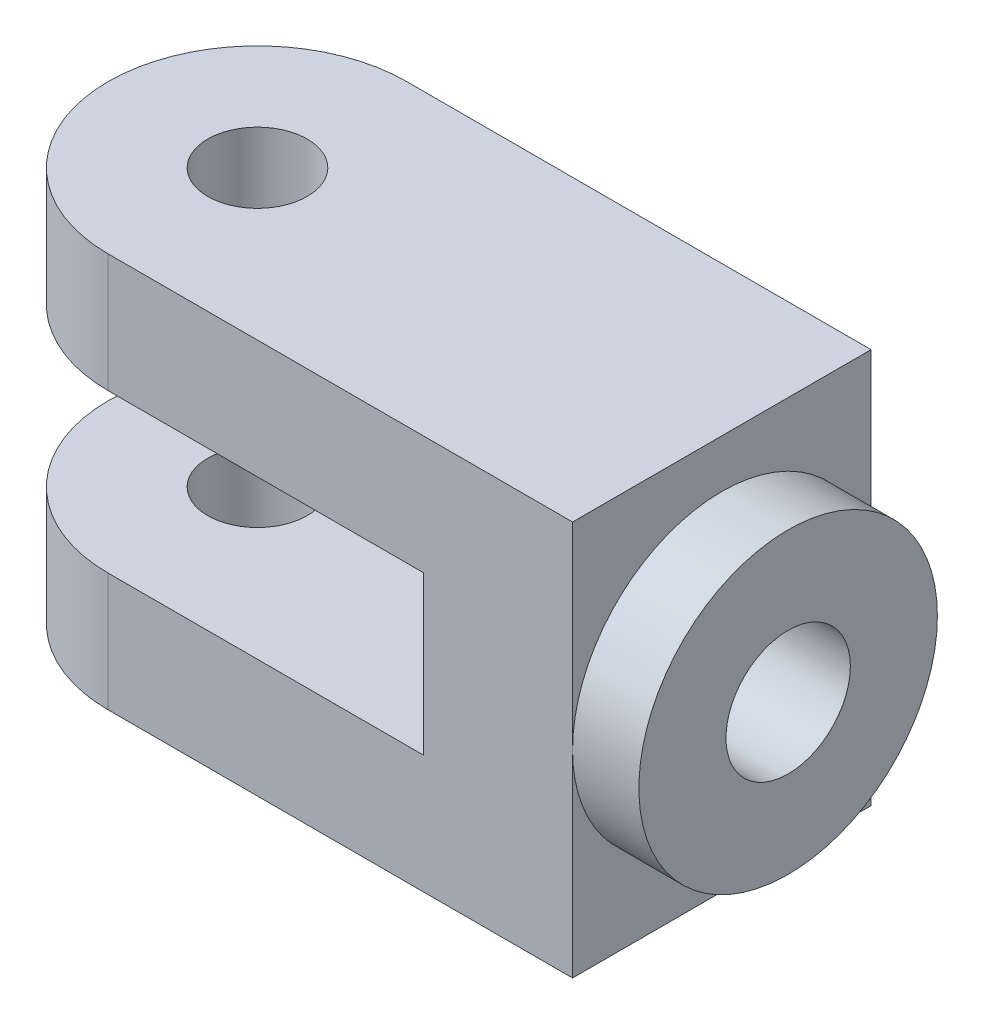
ISO-10303-21;
HEADER;
FILE_DESCRIPTION(('STEP AP214'),'2;1');
FILE_NAME('part.step','',(''),(''),'','','');
FILE_SCHEMA(('AUTOMOTIVE_DESIGN { 1 0 10303 214 1 1 1 1 }'));
ENDSEC;
DATA;
#1=APPLICATION_CONTEXT('core data for automotive mechanical design processes');
#2=APPLICATION_PROTOCOL_DEFINITION('international standard','automotive_design',2000,#1);
#3=PRODUCT_CONTEXT('',#1,'mechanical');
#4=PRODUCT('Part','Part','',(#3));
#5=PRODUCT_RELATED_PRODUCT_CATEGORY('part','',(#4));
#6=PRODUCT_DEFINITION_FORMATION('','',#4);
#7=PRODUCT_DEFINITION_CONTEXT('part definition',#1,'design');
#8=PRODUCT_DEFINITION('design','',#6,#7);
#9=PRODUCT_DEFINITION_SHAPE('','',#8);
#10=(LENGTH_UNIT() NAMED_UNIT(*) SI_UNIT(.MILLI.,.METRE.));
#11=(NAMED_UNIT(*) PLANE_ANGLE_UNIT() SI_UNIT($,.RADIAN.));
#12=(NAMED_UNIT(*) SI_UNIT($,.STERADIAN.) SOLID_ANGLE_UNIT());
#13=UNCERTAINTY_MEASURE_WITH_UNIT(LENGTH_MEASURE(1.E-05),#10,'distance_accuracy_value','');
#14=(GEOMETRIC_REPRESENTATION_CONTEXT(3) GLOBAL_UNCERTAINTY_ASSIGNED_CONTEXT((#13)) GLOBAL_UNIT_ASSIGNED_CONTEXT((#10,
#11,#12)) REPRESENTATION_CONTEXT('',''));
#15=CARTESIAN_POINT('',(0.,0.,0.));
#16=DIRECTION('',(0.,0.,1.));
#17=DIRECTION('',(1.,0.,0.));
#18=AXIS2_PLACEMENT_3D('',#15,#16,#17);
#19=CARTESIAN_POINT('',(0.,47.625,36.));
#20=DIRECTION('',(-1.,0.,0.));
#21=DIRECTION('',(0.,0.,1.));
#22=AXIS2_PLACEMENT_3D('',#19,#20,#21);
#23=PLANE('',#22);
#24=CARTESIAN_POINT('',(0.,0.,0.));
#25=DIRECTION('',(1.,0.,0.));
#26=DIRECTION('',(0.,0.,-1.));
#27=AXIS2_PLACEMENT_3D('',#24,#25,#26);
#28=CIRCLE('',#27,36.);
#29=CARTESIAN_POINT('',(0.,0.,-36.));
#30=VERTEX_POINT('',#29);
#31=CARTESIAN_POINT('',(0.,0.,36.));
#32=VERTEX_POINT('',#31);
#33=EDGE_CURVE('E54',#30,#32,#28,.T.);
#34=ORIENTED_EDGE('',*,*,#33,.F.);
#35=DIRECTION('',(0.,-1.,0.));
#36=VECTOR('',#35,1.);
#37=CARTESIAN_POINT('',(0.,47.625,-36.));
#38=LINE('',#37,#36);
#39=CARTESIAN_POINT('',(0.,47.625,-36.));
#40=VERTEX_POINT('',#39);
#41=EDGE_CURVE('E116',#40,#30,#38,.T.);
#42=ORIENTED_EDGE('',*,*,#41,.F.);
#43=DIRECTION('',(0.,0.,-1.));
#44=VECTOR('',#43,1.);
#45=CARTESIAN_POINT('',(0.,47.625,36.));
#46=LINE('',#45,#44);
#47=CARTESIAN_POINT('',(0.,47.625,36.));
#48=VERTEX_POINT('',#47);
#49=EDGE_CURVE('E133',#48,#40,#46,.T.);
#50=ORIENTED_EDGE('',*,*,#49,.F.);
#51=DIRECTION('',(0.,-1.,0.));
#52=VECTOR('',#51,1.);
#53=CARTESIAN_POINT('',(0.,47.625,36.));
#54=LINE('',#53,#52);
#55=EDGE_CURVE('E137',#48,#32,#54,.T.);
#56=ORIENTED_EDGE('',*,*,#55,.T.);
#57=EDGE_LOOP('',(#34,#42,#50,#56));
#58=FACE_BOUND('',#57,.T.);
#59=ADVANCED_FACE('F43',(#58),#23,.F.);
#60=CARTESIAN_POINT('',(-112.,47.625,0.));
#61=DIRECTION('',(0.,-1.,0.));
#62=DIRECTION('',(0.,0.,-1.));
#63=AXIS2_PLACEMENT_3D('',#60,#61,#62);
#64=CYLINDRICAL_SURFACE('',#63,36.);
#65=DIRECTION('',(0.,-1.,0.));
#66=VECTOR('',#65,1.);
#67=CARTESIAN_POINT('',(-112.,47.625,-36.));
#68=LINE('',#67,#66);
#69=CARTESIAN_POINT('',(-112.,47.625,-36.));
#70=VERTEX_POINT('',#69);
#71=CARTESIAN_POINT('',(-112.,19.05,-36.));
#72=VERTEX_POINT('',#71);
#73=EDGE_CURVE('E52',#70,#72,#68,.T.);
#74=ORIENTED_EDGE('',*,*,#73,.T.);
#75=CARTESIAN_POINT('',(-112.,19.05,0.));
#76=DIRECTION('',(0.,1.,0.));
#77=DIRECTION('',(0.,0.,1.));
#78=AXIS2_PLACEMENT_3D('',#75,#76,#77);
#79=CIRCLE('',#78,36.);
#80=CARTESIAN_POINT('',(-112.,19.05,36.));
#81=VERTEX_POINT('',#80);
#82=EDGE_CURVE('E212',#72,#81,#79,.T.);
#83=ORIENTED_EDGE('',*,*,#82,.T.);
#84=DIRECTION('',(0.,-1.,0.));
#85=VECTOR('',#84,1.);
#86=CARTESIAN_POINT('',(-112.,47.625,36.));
#87=LINE('',#86,#85);
#88=CARTESIAN_POINT('',(-112.,47.625,36.));
#89=VERTEX_POINT('',#88);
#90=EDGE_CURVE('E239',#89,#81,#87,.T.);
#91=ORIENTED_EDGE('',*,*,#90,.F.);
#92=CARTESIAN_POINT('',(-112.,47.625,0.));
#93=DIRECTION('',(0.,1.,0.));
#94=DIRECTION('',(0.,0.,1.));
#95=AXIS2_PLACEMENT_3D('',#92,#93,#94);
#96=CIRCLE('',#95,36.);
#97=EDGE_CURVE('E224',#70,#89,#96,.T.);
#98=ORIENTED_EDGE('',*,*,#97,.F.);
#99=EDGE_LOOP('',(#74,#83,#91,#98));
#100=FACE_BOUND('',#99,.T.);
#101=ADVANCED_FACE('F160',(#100),#64,.T.);
#102=CARTESIAN_POINT('',(-112.,47.625,0.));
#103=DIRECTION('',(0.,-1.,0.));
#104=DIRECTION('',(0.,0.,-1.));
#105=AXIS2_PLACEMENT_3D('',#102,#103,#104);
#106=CYLINDRICAL_SURFACE('',#105,12.);
#107=CARTESIAN_POINT('',(-112.,-19.05,0.));
#108=DIRECTION('',(0.,-1.,0.));
#109=DIRECTION('',(0.,0.,-1.));
#110=AXIS2_PLACEMENT_3D('',#107,#108,#109);
#111=CIRCLE('',#110,12.);
#112=CARTESIAN_POINT('',(-112.,-19.05,-12.));
#113=VERTEX_POINT('',#112);
#114=EDGE_CURVE('E47',#113,#113,#111,.T.);
#115=ORIENTED_EDGE('',*,*,#114,.F.);
#116=EDGE_LOOP('',(#115));
#117=FACE_BOUND('',#116,.T.);
#118=CARTESIAN_POINT('',(-112.,-47.625,0.));
#119=DIRECTION('',(0.,1.,0.));
#120=DIRECTION('',(0.,0.,1.));
#121=AXIS2_PLACEMENT_3D('',#118,#119,#120);
#122=CIRCLE('',#121,12.);
#123=CARTESIAN_POINT('',(-112.,-47.625,12.));
#124=VERTEX_POINT('',#123);
#125=EDGE_CURVE('E216',#124,#124,#122,.T.);
#126=ORIENTED_EDGE('',*,*,#125,.F.);
#127=EDGE_LOOP('',(#126));
#128=FACE_BOUND('',#127,.T.);
#129=ADVANCED_FACE('F167',(#117,#128),#106,.F.);
#130=CARTESIAN_POINT('',(-112.,47.625,0.));
#131=DIRECTION('',(0.,1.,0.));
#132=DIRECTION('',(0.,0.,1.));
#133=AXIS2_PLACEMENT_3D('',#130,#131,#132);
#134=PLANE('',#133);
#135=DIRECTION('',(-1.,0.,0.));
#136=VECTOR('',#135,1.);
#137=CARTESIAN_POINT('',(0.,47.625,-36.));
#138=LINE('',#137,#136);
#139=EDGE_CURVE('E123',#40,#70,#138,.T.);
#140=ORIENTED_EDGE('',*,*,#139,.T.);
#141=ORIENTED_EDGE('',*,*,#97,.T.);
#142=DIRECTION('',(1.,0.,0.));
#143=VECTOR('',#142,1.);
#144=CARTESIAN_POINT('',(-112.,47.625,36.));
#145=LINE('',#144,#143);
#146=EDGE_CURVE('E226',#89,#48,#145,.T.);
#147=ORIENTED_EDGE('',*,*,#146,.T.);
#148=ORIENTED_EDGE('',*,*,#49,.T.);
#149=EDGE_LOOP('',(#140,#141,#147,#148));
#150=FACE_BOUND('',#149,.T.);
#151=CARTESIAN_POINT('',(-112.,47.625,0.));
#152=DIRECTION('',(0.,1.,0.));
#153=DIRECTION('',(0.,0.,1.));
#154=AXIS2_PLACEMENT_3D('',#151,#152,#153);
#155=CIRCLE('',#154,12.);
#156=CARTESIAN_POINT('',(-112.,47.625,12.));
#157=VERTEX_POINT('',#156);
#158=EDGE_CURVE('E217',#157,#157,#155,.T.);
#159=ORIENTED_EDGE('',*,*,#158,.F.);
#160=EDGE_LOOP('',(#159));
#161=FACE_BOUND('',#160,.T.);
#162=ADVANCED_FACE('F250',(#150,#161),#134,.T.);
#163=CARTESIAN_POINT('',(-112.,-47.625,0.));
#164=DIRECTION('',(0.,1.,0.));
#165=DIRECTION('',(0.,0.,1.));
#166=AXIS2_PLACEMENT_3D('',#163,#164,#165);
#167=PLANE('',#166);
#168=DIRECTION('',(-1.,0.,0.));
#169=VECTOR('',#168,1.);
#170=CARTESIAN_POINT('',(0.,-47.625,-36.));
#171=LINE('',#170,#169);
#172=CARTESIAN_POINT('',(0.,-47.625,-36.));
#173=VERTEX_POINT('',#172);
#174=CARTESIAN_POINT('',(-112.,-47.625,-36.));
#175=VERTEX_POINT('',#174);
#176=EDGE_CURVE('E220',#173,#175,#171,.T.);
#177=ORIENTED_EDGE('',*,*,#176,.F.);
#178=DIRECTION('',(0.,0.,-1.));
#179=VECTOR('',#178,1.);
#180=CARTESIAN_POINT('',(0.,-47.625,36.));
#181=LINE('',#180,#179);
#182=CARTESIAN_POINT('',(0.,-47.625,36.));
#183=VERTEX_POINT('',#182);
#184=EDGE_CURVE('E131',#183,#173,#181,.T.);
#185=ORIENTED_EDGE('',*,*,#184,.F.);
#186=DIRECTION('',(1.,0.,0.));
#187=VECTOR('',#186,1.);
#188=CARTESIAN_POINT('',(-112.,-47.625,36.));
#189=LINE('',#188,#187);
#190=CARTESIAN_POINT('',(-112.,-47.625,36.));
#191=VERTEX_POINT('',#190);
#192=EDGE_CURVE('E233',#191,#183,#189,.T.);
#193=ORIENTED_EDGE('',*,*,#192,.F.);
#194=CARTESIAN_POINT('',(-112.,-47.625,0.));
#195=DIRECTION('',(0.,1.,0.));
#196=DIRECTION('',(0.,0.,1.));
#197=AXIS2_PLACEMENT_3D('',#194,#195,#196);
#198=CIRCLE('',#197,36.);
#199=EDGE_CURVE('E230',#175,#191,#198,.T.);
#200=ORIENTED_EDGE('',*,*,#199,.F.);
#201=EDGE_LOOP('',(#177,#185,#193,#200));
#202=FACE_BOUND('',#201,.T.);
#203=ORIENTED_EDGE('',*,*,#125,.T.);
#204=EDGE_LOOP('',(#203));
#205=FACE_BOUND('',#204,.T.);
#206=ADVANCED_FACE('F252',(#202,#205),#167,.F.);
#207=CARTESIAN_POINT('',(0.,47.625,-36.));
#208=DIRECTION('',(0.,0.,1.));
#209=DIRECTION('',(1.,0.,0.));
#210=AXIS2_PLACEMENT_3D('',#207,#208,#209);
#211=PLANE('',#210);
#212=CARTESIAN_POINT('',(-112.,-19.05,-36.));
#213=VERTEX_POINT('',#212);
#214=EDGE_CURVE('E241',#213,#175,#68,.T.);
#215=ORIENTED_EDGE('',*,*,#214,.F.);
#216=DIRECTION('',(1.,0.,0.));
#217=VECTOR('',#216,1.);
#218=CARTESIAN_POINT('',(-148.,-19.05,-36.));
#219=LINE('',#218,#217);
#220=CARTESIAN_POINT('',(-36.,-19.05,-36.));
#221=VERTEX_POINT('',#220);
#222=EDGE_CURVE('E205',#213,#221,#219,.T.);
#223=ORIENTED_EDGE('',*,*,#222,.T.);
#224=DIRECTION('',(0.,1.,0.));
#225=VECTOR('',#224,1.);
#226=CARTESIAN_POINT('',(-36.,19.05,-36.));
#227=LINE('',#226,#225);
#228=CARTESIAN_POINT('',(-36.,19.05,-36.));
#229=VERTEX_POINT('',#228);
#230=EDGE_CURVE('E201',#221,#229,#227,.T.);
#231=ORIENTED_EDGE('',*,*,#230,.T.);
#232=DIRECTION('',(1.,0.,0.));
#233=VECTOR('',#232,1.);
#234=CARTESIAN_POINT('',(-148.,19.05,-36.));
#235=LINE('',#234,#233);
#236=EDGE_CURVE('E199',#72,#229,#235,.T.);
#237=ORIENTED_EDGE('',*,*,#236,.F.);
#238=ORIENTED_EDGE('',*,*,#73,.F.);
#239=ORIENTED_EDGE('',*,*,#139,.F.);
#240=ORIENTED_EDGE('',*,*,#41,.T.);
#241=EDGE_CURVE('E119',#30,#173,#38,.T.);
#242=ORIENTED_EDGE('',*,*,#241,.T.);
#243=ORIENTED_EDGE('',*,*,#176,.T.);
#244=EDGE_LOOP('',(#215,#223,#231,#237,#238,#239,#240,#242,#243));
#245=FACE_BOUND('',#244,.T.);
#246=ADVANCED_FACE('F45',(#245),#211,.F.);
#247=CARTESIAN_POINT('',(-112.,-19.05,36.));
#248=VERTEX_POINT('',#247);
#249=EDGE_CURVE('E238',#248,#191,#87,.T.);
#250=ORIENTED_EDGE('',*,*,#249,.F.);
#251=CARTESIAN_POINT('',(-112.,-19.05,0.));
#252=DIRECTION('',(0.,-1.,0.));
#253=DIRECTION('',(0.,0.,-1.));
#254=AXIS2_PLACEMENT_3D('',#251,#252,#253);
#255=CIRCLE('',#254,36.);
#256=EDGE_CURVE('E214',#248,#213,#255,.T.);
#257=ORIENTED_EDGE('',*,*,#256,.T.);
#258=ORIENTED_EDGE('',*,*,#214,.T.);
#259=ORIENTED_EDGE('',*,*,#199,.T.);
#260=EDGE_LOOP('',(#250,#257,#258,#259));
#261=FACE_BOUND('',#260,.T.);
#262=ADVANCED_FACE('F169',(#261),#64,.T.);
#263=CARTESIAN_POINT('',(-112.,47.625,36.));
#264=DIRECTION('',(0.,0.,-1.));
#265=DIRECTION('',(-1.,0.,0.));
#266=AXIS2_PLACEMENT_3D('',#263,#264,#265);
#267=PLANE('',#266);
#268=DIRECTION('',(0.,-1.,0.));
#269=VECTOR('',#268,1.);
#270=CARTESIAN_POINT('',(-36.,19.05,36.));
#271=LINE('',#270,#269);
#272=CARTESIAN_POINT('',(-36.,19.05,36.));
#273=VERTEX_POINT('',#272);
#274=CARTESIAN_POINT('',(-36.,-19.05,36.));
#275=VERTEX_POINT('',#274);
#276=EDGE_CURVE('E189',#273,#275,#271,.T.);
#277=ORIENTED_EDGE('',*,*,#276,.T.);
#278=DIRECTION('',(1.,0.,0.));
#279=VECTOR('',#278,1.);
#280=CARTESIAN_POINT('',(-148.,-19.05,36.));
#281=LINE('',#280,#279);
#282=EDGE_CURVE('E190',#248,#275,#281,.T.);
#283=ORIENTED_EDGE('',*,*,#282,.F.);
#284=ORIENTED_EDGE('',*,*,#249,.T.);
#285=ORIENTED_EDGE('',*,*,#192,.T.);
#286=EDGE_CURVE('E127',#32,#183,#54,.T.);
#287=ORIENTED_EDGE('',*,*,#286,.F.);
#288=ORIENTED_EDGE('',*,*,#55,.F.);
#289=ORIENTED_EDGE('',*,*,#146,.F.);
#290=ORIENTED_EDGE('',*,*,#90,.T.);
#291=DIRECTION('',(1.,0.,0.));
#292=VECTOR('',#291,1.);
#293=CARTESIAN_POINT('',(-148.,19.05,36.));
#294=LINE('',#293,#292);
#295=EDGE_CURVE('E194',#81,#273,#294,.T.);
#296=ORIENTED_EDGE('',*,*,#295,.T.);
#297=EDGE_LOOP('',(#277,#283,#284,#285,#287,#288,#289,#290,#296));
#298=FACE_BOUND('',#297,.T.);
#299=ADVANCED_FACE('F173',(#298),#267,.F.);
#300=EDGE_CURVE('E11',#32,#30,#28,.T.);
#301=ORIENTED_EDGE('',*,*,#300,.F.);
#302=ORIENTED_EDGE('',*,*,#286,.T.);
#303=ORIENTED_EDGE('',*,*,#184,.T.);
#304=ORIENTED_EDGE('',*,*,#241,.F.);
#305=EDGE_LOOP('',(#301,#302,#303,#304));
#306=FACE_BOUND('',#305,.T.);
#307=ADVANCED_FACE('F129',(#306),#23,.F.);
#308=CARTESIAN_POINT('',(-112.,19.05,0.));
#309=DIRECTION('',(0.,1.,0.));
#310=DIRECTION('',(0.,0.,1.));
#311=AXIS2_PLACEMENT_3D('',#308,#309,#310);
#312=CIRCLE('',#311,12.);
#313=CARTESIAN_POINT('',(-112.,19.05,12.));
#314=VERTEX_POINT('',#313);
#315=EDGE_CURVE('E208',#314,#314,#312,.T.);
#316=ORIENTED_EDGE('',*,*,#315,.F.);
#317=EDGE_LOOP('',(#316));
#318=FACE_BOUND('',#317,.T.);
#319=ORIENTED_EDGE('',*,*,#158,.T.);
#320=EDGE_LOOP('',(#319));
#321=FACE_BOUND('',#320,.T.);
#322=ADVANCED_FACE('F172',(#318,#321),#106,.F.);
#323=CARTESIAN_POINT('',(-148.,-19.05,-36.));
#324=DIRECTION('',(0.,-1.,0.));
#325=DIRECTION('',(0.,0.,-1.));
#326=AXIS2_PLACEMENT_3D('',#323,#324,#325);
#327=PLANE('',#326);
#328=ORIENTED_EDGE('',*,*,#114,.T.);
#329=EDGE_LOOP('',(#328));
#330=FACE_BOUND('',#329,.T.);
#331=ORIENTED_EDGE('',*,*,#282,.T.);
#332=DIRECTION('',(0.,0.,-1.));
#333=VECTOR('',#332,1.);
#334=CARTESIAN_POINT('',(-36.,-19.05,-36.));
#335=LINE('',#334,#333);
#336=EDGE_CURVE('E67',#275,#221,#335,.T.);
#337=ORIENTED_EDGE('',*,*,#336,.T.);
#338=ORIENTED_EDGE('',*,*,#222,.F.);
#339=ORIENTED_EDGE('',*,*,#256,.F.);
#340=EDGE_LOOP('',(#331,#337,#338,#339));
#341=FACE_BOUND('',#340,.T.);
#342=ADVANCED_FACE('F178',(#330,#341),#327,.F.);
#343=CARTESIAN_POINT('',(-148.,19.05,-36.));
#344=DIRECTION('',(0.,1.,0.));
#345=DIRECTION('',(0.,0.,1.));
#346=AXIS2_PLACEMENT_3D('',#343,#344,#345);
#347=PLANE('',#346);
#348=ORIENTED_EDGE('',*,*,#315,.T.);
#349=EDGE_LOOP('',(#348));
#350=FACE_BOUND('',#349,.T.);
#351=ORIENTED_EDGE('',*,*,#236,.T.);
#352=DIRECTION('',(0.,0.,1.));
#353=VECTOR('',#352,1.);
#354=CARTESIAN_POINT('',(-36.,19.05,-36.));
#355=LINE('',#354,#353);
#356=EDGE_CURVE('E197',#229,#273,#355,.T.);
#357=ORIENTED_EDGE('',*,*,#356,.T.);
#358=ORIENTED_EDGE('',*,*,#295,.F.);
#359=ORIENTED_EDGE('',*,*,#82,.F.);
#360=EDGE_LOOP('',(#351,#357,#358,#359));
#361=FACE_BOUND('',#360,.T.);
#362=ADVANCED_FACE('F155',(#350,#361),#347,.F.);
#363=CARTESIAN_POINT('',(-36.,0.,0.));
#364=DIRECTION('',(-1.,0.,0.));
#365=DIRECTION('',(0.,0.,1.));
#366=AXIS2_PLACEMENT_3D('',#363,#364,#365);
#367=PLANE('',#366);
#368=CARTESIAN_POINT('',(-36.,0.,0.));
#369=DIRECTION('',(-1.,0.,0.));
#370=DIRECTION('',(0.,0.,1.));
#371=AXIS2_PLACEMENT_3D('',#368,#369,#370);
#372=CIRCLE('',#371,15.);
#373=CARTESIAN_POINT('',(-36.,0.,-15.));
#374=VERTEX_POINT('',#373);
#375=EDGE_CURVE('E140',#374,#374,#372,.T.);
#376=ORIENTED_EDGE('',*,*,#375,.F.);
#377=EDGE_LOOP('',(#376));
#378=FACE_BOUND('',#377,.T.);
#379=ORIENTED_EDGE('',*,*,#230,.F.);
#380=ORIENTED_EDGE('',*,*,#336,.F.);
#381=ORIENTED_EDGE('',*,*,#276,.F.);
#382=ORIENTED_EDGE('',*,*,#356,.F.);
#383=EDGE_LOOP('',(#379,#380,#381,#382));
#384=FACE_BOUND('',#383,.T.);
#385=ADVANCED_FACE('F144',(#378,#384),#367,.T.);
#386=CARTESIAN_POINT('',(16.,0.,0.));
#387=DIRECTION('',(-1.,0.,0.));
#388=DIRECTION('',(0.,0.,1.));
#389=AXIS2_PLACEMENT_3D('',#386,#387,#388);
#390=CYLINDRICAL_SURFACE('',#389,36.);
#391=CARTESIAN_POINT('',(16.,0.,0.));
#392=DIRECTION('',(1.,0.,0.));
#393=DIRECTION('',(0.,0.,-1.));
#394=AXIS2_PLACEMENT_3D('',#391,#392,#393);
#395=CIRCLE('',#394,36.);
#396=CARTESIAN_POINT('',(16.,0.,-36.));
#397=VERTEX_POINT('',#396);
#398=EDGE_CURVE('E139',#397,#397,#395,.T.);
#399=ORIENTED_EDGE('',*,*,#398,.F.);
#400=EDGE_LOOP('',(#399));
#401=FACE_BOUND('',#400,.T.);
#402=ORIENTED_EDGE('',*,*,#33,.T.);
#403=ORIENTED_EDGE('',*,*,#300,.T.);
#404=EDGE_LOOP('',(#402,#403));
#405=FACE_BOUND('',#404,.T.);
#406=ADVANCED_FACE('F141',(#401,#405),#390,.T.);
#407=CARTESIAN_POINT('',(16.,0.,0.));
#408=DIRECTION('',(1.,0.,0.));
#409=DIRECTION('',(0.,0.,-1.));
#410=AXIS2_PLACEMENT_3D('',#407,#408,#409);
#411=PLANE('',#410);
#412=CARTESIAN_POINT('',(16.,0.,0.));
#413=DIRECTION('',(1.,0.,0.));
#414=DIRECTION('',(0.,0.,-1.));
#415=AXIS2_PLACEMENT_3D('',#412,#413,#414);
#416=CIRCLE('',#415,15.);
#417=CARTESIAN_POINT('',(16.,0.,-15.));
#418=VERTEX_POINT('',#417);
#419=EDGE_CURVE('E281',#418,#418,#416,.T.);
#420=ORIENTED_EDGE('',*,*,#419,.F.);
#421=EDGE_LOOP('',(#420));
#422=FACE_BOUND('',#421,.T.);
#423=ORIENTED_EDGE('',*,*,#398,.T.);
#424=EDGE_LOOP('',(#423));
#425=FACE_BOUND('',#424,.T.);
#426=ADVANCED_FACE('F143',(#422,#425),#411,.T.);
#427=CARTESIAN_POINT('',(-148.,0.,0.));
#428=DIRECTION('',(1.,0.,0.));
#429=DIRECTION('',(0.,0.,-1.));
#430=AXIS2_PLACEMENT_3D('',#427,#428,#429);
#431=CYLINDRICAL_SURFACE('',#430,15.);
#432=CARTESIAN_POINT('',(-36.,0.,-15.));
#433=CARTESIAN_POINT('',(-35.4583333333333,0.,-15.));
#434=CARTESIAN_POINT('',(-34.9166666666667,0.,-15.));
#435=CARTESIAN_POINT('',(-33.8333333333333,0.,-15.));
#436=CARTESIAN_POINT('',(-33.2916666666667,0.,-15.));
#437=CARTESIAN_POINT('',(-32.2083333333333,0.,-15.));
#438=CARTESIAN_POINT('',(-31.6666666666667,0.,-15.));
#439=CARTESIAN_POINT('',(-30.5833333333333,0.,-15.));
#440=CARTESIAN_POINT('',(-30.0416666666667,0.,-15.));
#441=CARTESIAN_POINT('',(-28.9583333333333,0.,-15.));
#442=CARTESIAN_POINT('',(-28.4166666666667,0.,-15.));
#443=CARTESIAN_POINT('',(-27.3333333333333,0.,-15.));
#444=CARTESIAN_POINT('',(-26.7916666666667,0.,-15.));
#445=CARTESIAN_POINT('',(-25.7083333333333,0.,-15.));
#446=CARTESIAN_POINT('',(-25.1666666666667,0.,-15.));
#447=CARTESIAN_POINT('',(-24.0833333333333,0.,-15.));
#448=CARTESIAN_POINT('',(-23.5416666666667,0.,-15.));
#449=CARTESIAN_POINT('',(-22.4583333333333,0.,-15.));
#450=CARTESIAN_POINT('',(-21.9166666666667,0.,-15.));
#451=CARTESIAN_POINT('',(-20.8333333333333,0.,-15.));
#452=CARTESIAN_POINT('',(-20.2916666666667,0.,-15.));
#453=CARTESIAN_POINT('',(-19.2083333333333,0.,-15.));
#454=CARTESIAN_POINT('',(-18.6666666666667,0.,-15.));
#455=CARTESIAN_POINT('',(-17.5833333333333,0.,-15.));
#456=CARTESIAN_POINT('',(-17.0416666666667,0.,-15.));
#457=CARTESIAN_POINT('',(-15.9583333333333,0.,-15.));
#458=CARTESIAN_POINT('',(-15.4166666666667,0.,-15.));
#459=CARTESIAN_POINT('',(-14.3333333333333,0.,-15.));
#460=CARTESIAN_POINT('',(-13.7916666666667,0.,-15.));
#461=CARTESIAN_POINT('',(-12.7083333333333,0.,-15.));
#462=CARTESIAN_POINT('',(-12.1666666666667,0.,-15.));
#463=CARTESIAN_POINT('',(-11.0833333333334,0.,-15.));
#464=CARTESIAN_POINT('',(-10.5416666666667,0.,-15.));
#465=CARTESIAN_POINT('',(-9.45833333333334,0.,-15.));
#466=CARTESIAN_POINT('',(-8.91666666666666,0.,-15.));
#467=CARTESIAN_POINT('',(-7.83333333333333,0.,-15.));
#468=CARTESIAN_POINT('',(-7.29166666666667,0.,-15.));
#469=CARTESIAN_POINT('',(-6.20833333333334,0.,-15.));
#470=CARTESIAN_POINT('',(-5.66666666666668,0.,-15.));
#471=CARTESIAN_POINT('',(-4.58333333333335,0.,-15.));
#472=CARTESIAN_POINT('',(-4.04166666666667,0.,-15.));
#473=CARTESIAN_POINT('',(-2.95833333333334,0.,-15.));
#474=CARTESIAN_POINT('',(-2.41666666666668,0.,-15.));
#475=CARTESIAN_POINT('',(-1.33333333333334,0.,-15.));
#476=CARTESIAN_POINT('',(-0.791666666666672,0.,-15.));
#477=CARTESIAN_POINT('',(0.291666666666662,0.,-15.));
#478=CARTESIAN_POINT('',(0.833333333333325,0.,-15.));
#479=CARTESIAN_POINT('',(1.91666666666665,0.,-15.));
#480=CARTESIAN_POINT('',(2.45833333333331,0.,-15.));
#481=CARTESIAN_POINT('',(3.54166666666665,0.,-15.));
#482=CARTESIAN_POINT('',(4.08333333333332,0.,-15.));
#483=CARTESIAN_POINT('',(5.16666666666666,0.,-15.));
#484=CARTESIAN_POINT('',(5.70833333333333,0.,-15.));
#485=CARTESIAN_POINT('',(6.79166666666667,0.,-15.));
#486=CARTESIAN_POINT('',(7.33333333333333,0.,-15.));
#487=CARTESIAN_POINT('',(8.41666666666666,0.,-15.));
#488=CARTESIAN_POINT('',(8.95833333333332,0.,-15.));
#489=CARTESIAN_POINT('',(10.0416666666667,0.,-15.));
#490=CARTESIAN_POINT('',(10.5833333333333,0.,-15.));
#491=CARTESIAN_POINT('',(11.6666666666667,0.,-15.));
#492=CARTESIAN_POINT('',(12.2083333333333,0.,-15.));
#493=CARTESIAN_POINT('',(13.2916666666667,0.,-15.));
#494=CARTESIAN_POINT('',(13.8333333333333,0.,-15.));
#495=CARTESIAN_POINT('',(14.9166666666667,0.,-15.));
#496=CARTESIAN_POINT('',(15.4583333333333,0.,-15.));
#497=CARTESIAN_POINT('',(16.,0.,-15.));
#498=B_SPLINE_CURVE_WITH_KNOTS('',3,(#432,#433,#434,#435,#436,#437,#438,#439,#440,#441,#442,
#443,#444,#445,#446,#447,#448,#449,#450,#451,#452,#453,#454,#455,#456,#457,#458,#459,#460,#461,
#462,#463,#464,#465,#466,#467,#468,#469,#470,#471,#472,#473,#474,#475,#476,#477,#478,#479,#480,
#481,#482,#483,#484,#485,#486,#487,#488,#489,#490,#491,#492,#493,#494,#495,#496,#497),
.UNSPECIFIED.,.F.,.F.,(4,2,2,2,2,2,2,2,2,2,2,2,2,2,2,2,2,2,2,2,2,2,2,2,2,2,2,2,2,2,2,2,4),(0.,
1.625,3.25,4.875,6.50000000000001,8.12499999999999,9.74999999999999,11.375,13.,14.625,16.25,
17.875,19.5,21.125,22.75,24.375,26.,27.625,29.25,30.875,32.5,34.125,35.75,37.375,39.,40.625,
42.25,43.875,45.5,47.125,48.75,50.375,52.),.UNSPECIFIED.);
#499=EDGE_CURVE('BSEAM152',#374,#418,#498,.T.);
#500=ORIENTED_EDGE('',*,*,#375,.T.);
#501=ORIENTED_EDGE('',*,*,#419,.T.);
#502=ORIENTED_EDGE('',*,*,#499,.T.);
#503=ORIENTED_EDGE('',*,*,#499,.F.);
#504=EDGE_LOOP('',(#500,#502,#501,#503));
#505=FACE_BOUND('',#504,.T.);
#506=ADVANCED_FACE('F152',(#505),#431,.F.);
#507=CLOSED_SHELL('',(#59,#101,#129,#162,#206,#246,#262,#299,#307,#322,#342,#362,#385,#406,#426,#506));
#508=MANIFOLD_SOLID_BREP('B2',#507);
#509=ADVANCED_BREP_SHAPE_REPRESENTATION('',(#18,#508),#14);
#510=SHAPE_DEFINITION_REPRESENTATION(#9,#509);
ENDSEC;
END-ISO-10303-21;
